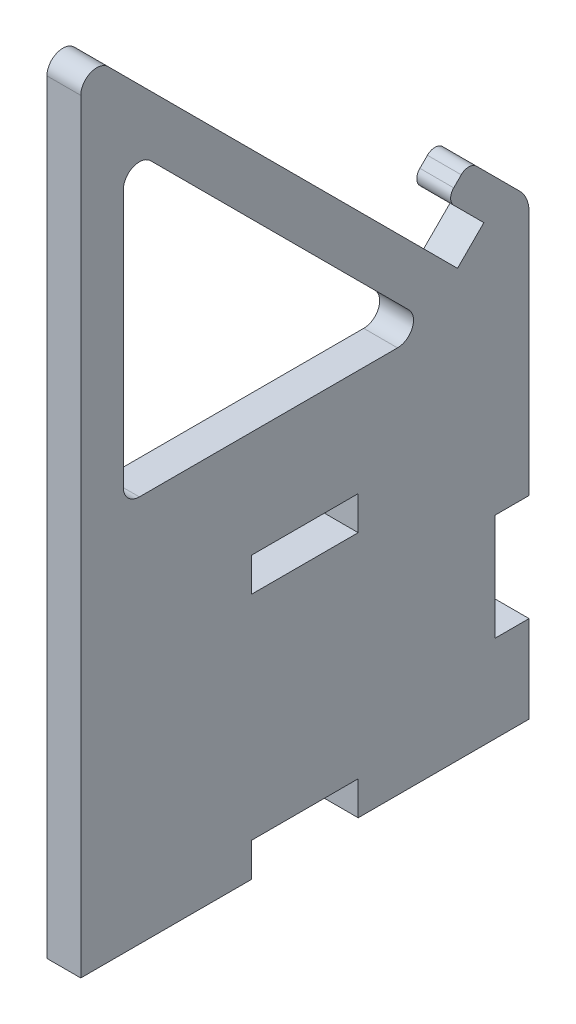
ISO-10303-21;
HEADER;
FILE_DESCRIPTION(('STEP AP214'),'2;1');
FILE_NAME('part.step','',(''),(''),'','','');
FILE_SCHEMA(('AUTOMOTIVE_DESIGN { 1 0 10303 214 1 1 1 1 }'));
ENDSEC;
DATA;
#1=APPLICATION_CONTEXT('core data for automotive mechanical design processes');
#2=APPLICATION_PROTOCOL_DEFINITION('international standard','automotive_design',2000,#1);
#3=PRODUCT_CONTEXT('',#1,'mechanical');
#4=PRODUCT('Part','Part','',(#3));
#5=PRODUCT_RELATED_PRODUCT_CATEGORY('part','',(#4));
#6=PRODUCT_DEFINITION_FORMATION('','',#4);
#7=PRODUCT_DEFINITION_CONTEXT('part definition',#1,'design');
#8=PRODUCT_DEFINITION('design','',#6,#7);
#9=PRODUCT_DEFINITION_SHAPE('','',#8);
#10=(LENGTH_UNIT() NAMED_UNIT(*) SI_UNIT(.MILLI.,.METRE.));
#11=(NAMED_UNIT(*) PLANE_ANGLE_UNIT() SI_UNIT($,.RADIAN.));
#12=(NAMED_UNIT(*) SI_UNIT($,.STERADIAN.) SOLID_ANGLE_UNIT());
#13=UNCERTAINTY_MEASURE_WITH_UNIT(LENGTH_MEASURE(1.E-05),#10,'distance_accuracy_value','');
#14=(GEOMETRIC_REPRESENTATION_CONTEXT(3) GLOBAL_UNCERTAINTY_ASSIGNED_CONTEXT((#13)) GLOBAL_UNIT_ASSIGNED_CONTEXT((#10,
#11,#12)) REPRESENTATION_CONTEXT('',''));
#15=CARTESIAN_POINT('',(0.,0.,0.));
#16=DIRECTION('',(0.,0.,1.));
#17=DIRECTION('',(1.,0.,0.));
#18=AXIS2_PLACEMENT_3D('',#15,#16,#17);
#19=CARTESIAN_POINT('',(6.35,0.,42.0728534805994));
#20=DIRECTION('',(0.,1.,0.));
#21=DIRECTION('',(0.,0.,1.));
#22=AXIS2_PLACEMENT_3D('',#19,#20,#21);
#23=PLANE('',#22);
#24=DIRECTION('',(0.,0.,-1.));
#25=VECTOR('',#24,1.);
#26=CARTESIAN_POINT('',(0.,0.,42.0728534805994));
#27=LINE('',#26,#25);
#28=CARTESIAN_POINT('',(0.,0.,42.0728534805994));
#29=VERTEX_POINT('',#28);
#30=CARTESIAN_POINT('',(0.,0.,10.));
#31=VERTEX_POINT('',#30);
#32=EDGE_CURVE('E255',#29,#31,#27,.T.);
#33=ORIENTED_EDGE('',*,*,#32,.T.);
#34=DIRECTION('',(1.,0.,0.));
#35=VECTOR('',#34,1.);
#36=CARTESIAN_POINT('',(0.,0.,10.));
#37=LINE('',#36,#35);
#38=CARTESIAN_POINT('',(6.35,0.,10.));
#39=VERTEX_POINT('',#38);
#40=EDGE_CURVE('E238',#31,#39,#37,.T.);
#41=ORIENTED_EDGE('',*,*,#40,.T.);
#42=DIRECTION('',(0.,0.,-1.));
#43=VECTOR('',#42,1.);
#44=CARTESIAN_POINT('',(6.35,0.,42.0728534805994));
#45=LINE('',#44,#43);
#46=CARTESIAN_POINT('',(6.35,0.,42.0728534805994));
#47=VERTEX_POINT('',#46);
#48=EDGE_CURVE('E545',#47,#39,#45,.T.);
#49=ORIENTED_EDGE('',*,*,#48,.F.);
#50=DIRECTION('',(-1.,0.,0.));
#51=VECTOR('',#50,1.);
#52=CARTESIAN_POINT('',(6.35,0.,42.0728534805994));
#53=LINE('',#52,#51);
#54=EDGE_CURVE('E263',#47,#29,#53,.T.);
#55=ORIENTED_EDGE('',*,*,#54,.T.);
#56=EDGE_LOOP('',(#33,#41,#49,#55));
#57=FACE_BOUND('',#56,.T.);
#58=ADVANCED_FACE('F39',(#57),#23,.F.);
#59=CARTESIAN_POINT('',(6.35,0.,-42.0728534805994));
#60=DIRECTION('',(0.,0.,1.));
#61=DIRECTION('',(0.,-1.,0.));
#62=AXIS2_PLACEMENT_3D('',#59,#60,#61);
#63=PLANE('',#62);
#64=DIRECTION('',(0.,1.,0.));
#65=VECTOR('',#64,1.);
#66=CARTESIAN_POINT('',(0.,0.,-42.0728534805994));
#67=LINE('',#66,#65);
#68=CARTESIAN_POINT('',(0.,0.,-42.0728534805994));
#69=VERTEX_POINT('',#68);
#70=CARTESIAN_POINT('',(0.,16.35,-42.0728534805994));
#71=VERTEX_POINT('',#70);
#72=EDGE_CURVE('E271',#69,#71,#67,.T.);
#73=ORIENTED_EDGE('',*,*,#72,.T.);
#74=DIRECTION('',(1.,0.,0.));
#75=VECTOR('',#74,1.);
#76=CARTESIAN_POINT('',(0.,16.35,-42.0728534805994));
#77=LINE('',#76,#75);
#78=CARTESIAN_POINT('',(6.35,16.35,-42.0728534805994));
#79=VERTEX_POINT('',#78);
#80=EDGE_CURVE('E486',#71,#79,#77,.T.);
#81=ORIENTED_EDGE('',*,*,#80,.T.);
#82=DIRECTION('',(0.,1.,0.));
#83=VECTOR('',#82,1.);
#84=CARTESIAN_POINT('',(6.35,0.,-42.0728534805994));
#85=LINE('',#84,#83);
#86=CARTESIAN_POINT('',(6.35,0.,-42.0728534805994));
#87=VERTEX_POINT('',#86);
#88=EDGE_CURVE('E549',#87,#79,#85,.T.);
#89=ORIENTED_EDGE('',*,*,#88,.F.);
#90=DIRECTION('',(-1.,0.,0.));
#91=VECTOR('',#90,1.);
#92=CARTESIAN_POINT('',(6.35,0.,-42.0728534805994));
#93=LINE('',#92,#91);
#94=EDGE_CURVE('E306',#87,#69,#93,.T.);
#95=ORIENTED_EDGE('',*,*,#94,.T.);
#96=EDGE_LOOP('',(#73,#81,#89,#95));
#97=FACE_BOUND('',#96,.T.);
#98=ADVANCED_FACE('F593',(#97),#63,.F.);
#99=CARTESIAN_POINT('',(6.35,150.710678118654,42.0728534805994));
#100=DIRECTION('',(0.,0.,-1.));
#101=DIRECTION('',(0.,1.,0.));
#102=AXIS2_PLACEMENT_3D('',#99,#100,#101);
#103=PLANE('',#102);
#104=DIRECTION('',(0.,-1.,0.));
#105=VECTOR('',#104,1.);
#106=CARTESIAN_POINT('',(6.35,150.710678118654,42.0728534805994));
#107=LINE('',#106,#105);
#108=CARTESIAN_POINT('',(6.35,143.468037431535,42.0728534805994));
#109=VERTEX_POINT('',#108);
#110=EDGE_CURVE('E296',#109,#47,#107,.T.);
#111=ORIENTED_EDGE('',*,*,#110,.F.);
#112=DIRECTION('',(-1.,0.,0.));
#113=VECTOR('',#112,1.);
#114=CARTESIAN_POINT('',(6.35,143.468037431535,42.0728534805994));
#115=LINE('',#114,#113);
#116=CARTESIAN_POINT('',(0.,143.468037431535,42.0728534805994));
#117=VERTEX_POINT('',#116);
#118=EDGE_CURVE('E372',#109,#117,#115,.T.);
#119=ORIENTED_EDGE('',*,*,#118,.T.);
#120=DIRECTION('',(0.,-1.,0.));
#121=VECTOR('',#120,1.);
#122=CARTESIAN_POINT('',(0.,150.710678118654,42.0728534805994));
#123=LINE('',#122,#121);
#124=EDGE_CURVE('E273',#117,#29,#123,.T.);
#125=ORIENTED_EDGE('',*,*,#124,.T.);
#126=ORIENTED_EDGE('',*,*,#54,.F.);
#127=EDGE_LOOP('',(#111,#119,#125,#126));
#128=FACE_BOUND('',#127,.T.);
#129=ADVANCED_FACE('F575',(#128),#103,.F.);
#130=CARTESIAN_POINT('',(6.35,0.,-10.));
#131=VERTEX_POINT('',#130);
#132=EDGE_CURVE('E544',#131,#87,#45,.T.);
#133=ORIENTED_EDGE('',*,*,#132,.F.);
#134=DIRECTION('',(1.,0.,0.));
#135=VECTOR('',#134,1.);
#136=CARTESIAN_POINT('',(0.,0.,-10.));
#137=LINE('',#136,#135);
#138=CARTESIAN_POINT('',(0.,0.,-10.));
#139=VERTEX_POINT('',#138);
#140=EDGE_CURVE('E250',#139,#131,#137,.T.);
#141=ORIENTED_EDGE('',*,*,#140,.F.);
#142=EDGE_CURVE('E266',#139,#69,#27,.T.);
#143=ORIENTED_EDGE('',*,*,#142,.T.);
#144=ORIENTED_EDGE('',*,*,#94,.F.);
#145=EDGE_LOOP('',(#133,#141,#143,#144));
#146=FACE_BOUND('',#145,.T.);
#147=ADVANCED_FACE('F588',(#146),#23,.F.);
#148=CARTESIAN_POINT('',(0.,36.35,-42.0728534805994));
#149=VERTEX_POINT('',#148);
#150=CARTESIAN_POINT('',(0.,82.4644660940667,-42.0728534805994));
#151=VERTEX_POINT('',#150);
#152=EDGE_CURVE('E265',#149,#151,#67,.T.);
#153=ORIENTED_EDGE('',*,*,#152,.T.);
#154=DIRECTION('',(-1.,0.,0.));
#155=VECTOR('',#154,1.);
#156=CARTESIAN_POINT('',(6.35,82.4644660940667,-42.0728534805994));
#157=LINE('',#156,#155);
#158=CARTESIAN_POINT('',(6.35,82.4644660940667,-42.0728534805994));
#159=VERTEX_POINT('',#158);
#160=EDGE_CURVE('E319',#151,#159,#157,.F.);
#161=ORIENTED_EDGE('',*,*,#160,.T.);
#162=CARTESIAN_POINT('',(6.35,36.35,-42.0728534805994));
#163=VERTEX_POINT('',#162);
#164=EDGE_CURVE('E548',#163,#159,#85,.T.);
#165=ORIENTED_EDGE('',*,*,#164,.F.);
#166=DIRECTION('',(1.,0.,0.));
#167=VECTOR('',#166,1.);
#168=CARTESIAN_POINT('',(0.,36.35,-42.0728534805994));
#169=LINE('',#168,#167);
#170=EDGE_CURVE('E521',#149,#163,#169,.T.);
#171=ORIENTED_EDGE('',*,*,#170,.F.);
#172=EDGE_LOOP('',(#153,#161,#165,#171));
#173=FACE_BOUND('',#172,.T.);
#174=ADVANCED_FACE('F652',(#173),#63,.F.);
#175=CARTESIAN_POINT('',(6.35,84.9497474683053,-42.0728534805994));
#176=DIRECTION('',(0.,-0.707106781186558,0.707106781186537));
#177=DIRECTION('',(0.,-0.707106781186537,-0.707106781186558));
#178=AXIS2_PLACEMENT_3D('',#175,#176,#177);
#179=PLANE('',#178);
#180=DIRECTION('',(0.,0.707106781186537,0.707106781186558));
#181=VECTOR('',#180,1.);
#182=CARTESIAN_POINT('',(0.,84.9497474683053,-42.0728534805994));
#183=LINE('',#182,#181);
#184=CARTESIAN_POINT('',(0.,86.707106781186,-40.3154941677186));
#185=VERTEX_POINT('',#184);
#186=CARTESIAN_POINT('',(0.,94.8492424049166,-32.1733585439878));
#187=VERTEX_POINT('',#186);
#188=EDGE_CURVE('E279',#185,#187,#183,.T.);
#189=ORIENTED_EDGE('',*,*,#188,.T.);
#190=DIRECTION('',(-1.,0.,0.));
#191=VECTOR('',#190,1.);
#192=CARTESIAN_POINT('',(6.35,94.8492424049166,-32.1733585439878));
#193=LINE('',#192,#191);
#194=CARTESIAN_POINT('',(6.35,94.8492424049166,-32.1733585439878));
#195=VERTEX_POINT('',#194);
#196=EDGE_CURVE('E348',#187,#195,#193,.F.);
#197=ORIENTED_EDGE('',*,*,#196,.T.);
#198=DIRECTION('',(0.,0.707106781186537,0.707106781186558));
#199=VECTOR('',#198,1.);
#200=CARTESIAN_POINT('',(6.35,84.9497474683053,-42.0728534805994));
#201=LINE('',#200,#199);
#202=CARTESIAN_POINT('',(6.35,86.707106781186,-40.3154941677186));
#203=VERTEX_POINT('',#202);
#204=EDGE_CURVE('E553',#203,#195,#201,.T.);
#205=ORIENTED_EDGE('',*,*,#204,.F.);
#206=DIRECTION('',(-1.,0.,0.));
#207=VECTOR('',#206,1.);
#208=CARTESIAN_POINT('',(6.35,86.707106781186,-40.3154941677186));
#209=LINE('',#208,#207);
#210=EDGE_CURVE('E312',#203,#185,#209,.T.);
#211=ORIENTED_EDGE('',*,*,#210,.T.);
#212=EDGE_LOOP('',(#189,#197,#205,#211));
#213=FACE_BOUND('',#212,.T.);
#214=ADVANCED_FACE('F612',(#213),#179,.F.);
#215=CARTESIAN_POINT('',(6.35,96.2634559672896,-30.7591449816147));
#216=DIRECTION('',(0.,-0.70710678118655,-0.707106781186545));
#217=DIRECTION('',(0.,0.707106781186545,-0.70710678118655));
#218=AXIS2_PLACEMENT_3D('',#215,#216,#217);
#219=PLANE('',#218);
#220=DIRECTION('',(0.,-0.707106781186545,0.70710678118655));
#221=VECTOR('',#220,1.);
#222=CARTESIAN_POINT('',(0.,96.2634559672896,-30.7591449816147));
#223=LINE('',#222,#221);
#224=CARTESIAN_POINT('',(0.,94.8492424049166,-29.3449314192416));
#225=VERTEX_POINT('',#224);
#226=CARTESIAN_POINT('',(0.,93.4350288425435,-27.9307178568685));
#227=VERTEX_POINT('',#226);
#228=EDGE_CURVE('E283',#225,#227,#223,.T.);
#229=ORIENTED_EDGE('',*,*,#228,.T.);
#230=DIRECTION('',(-1.,0.,0.));
#231=VECTOR('',#230,1.);
#232=CARTESIAN_POINT('',(6.35,93.4350288425435,-27.9307178568685));
#233=LINE('',#232,#231);
#234=CARTESIAN_POINT('',(6.35,93.4350288425435,-27.9307178568685));
#235=VERTEX_POINT('',#234);
#236=EDGE_CURVE('E339',#227,#235,#233,.F.);
#237=ORIENTED_EDGE('',*,*,#236,.T.);
#238=DIRECTION('',(0.,-0.707106781186545,0.70710678118655));
#239=VECTOR('',#238,1.);
#240=CARTESIAN_POINT('',(6.35,96.2634559672896,-30.7591449816147));
#241=LINE('',#240,#239);
#242=CARTESIAN_POINT('',(6.35,94.8492424049166,-29.3449314192416));
#243=VERTEX_POINT('',#242);
#244=EDGE_CURVE('E557',#243,#235,#241,.T.);
#245=ORIENTED_EDGE('',*,*,#244,.F.);
#246=DIRECTION('',(-1.,0.,0.));
#247=VECTOR('',#246,1.);
#248=CARTESIAN_POINT('',(6.35,94.8492424049166,-29.3449314192416));
#249=LINE('',#248,#247);
#250=EDGE_CURVE('E335',#243,#225,#249,.T.);
#251=ORIENTED_EDGE('',*,*,#250,.T.);
#252=EDGE_LOOP('',(#229,#237,#245,#251));
#253=FACE_BOUND('',#252,.T.);
#254=ADVANCED_FACE('F622',(#253),#219,.F.);
#255=CARTESIAN_POINT('',(6.35,92.0208152801704,-26.5165042944954));
#256=DIRECTION('',(0.,0.707106781186544,-0.707106781186551));
#257=DIRECTION('',(0.,0.707106781186551,0.707106781186544));
#258=AXIS2_PLACEMENT_3D('',#255,#256,#257);
#259=PLANE('',#258);
#260=DIRECTION('',(0.,-0.707106781186551,-0.707106781186544));
#261=VECTOR('',#260,1.);
#262=CARTESIAN_POINT('',(6.35,92.0208152801704,-26.5165042944954));
#263=LINE('',#262,#261);
#264=CARTESIAN_POINT('',(6.35,90.6066017177973,-27.9307178568685));
#265=VERTEX_POINT('',#264);
#266=CARTESIAN_POINT('',(6.35,84.9497474683049,-33.5875721063609));
#267=VERTEX_POINT('',#266);
#268=EDGE_CURVE('E561',#265,#267,#263,.T.);
#269=ORIENTED_EDGE('',*,*,#268,.F.);
#270=DIRECTION('',(-1.,0.,0.));
#271=VECTOR('',#270,1.);
#272=CARTESIAN_POINT('',(6.35,90.6066017177973,-27.9307178568685));
#273=LINE('',#272,#271);
#274=CARTESIAN_POINT('',(0.,90.6066017177973,-27.9307178568685));
#275=VERTEX_POINT('',#274);
#276=EDGE_CURVE('E325',#265,#275,#273,.T.);
#277=ORIENTED_EDGE('',*,*,#276,.T.);
#278=DIRECTION('',(0.,-0.707106781186551,-0.707106781186544));
#279=VECTOR('',#278,1.);
#280=CARTESIAN_POINT('',(0.,92.0208152801704,-26.5165042944954));
#281=LINE('',#280,#279);
#282=CARTESIAN_POINT('',(0.,84.9497474683049,-33.5875721063609));
#283=VERTEX_POINT('',#282);
#284=EDGE_CURVE('E287',#275,#283,#281,.T.);
#285=ORIENTED_EDGE('',*,*,#284,.T.);
#286=DIRECTION('',(-1.,0.,0.));
#287=VECTOR('',#286,1.);
#288=CARTESIAN_POINT('',(6.35,84.9497474683049,-33.5875721063609));
#289=LINE('',#288,#287);
#290=EDGE_CURVE('E301',#267,#283,#289,.T.);
#291=ORIENTED_EDGE('',*,*,#290,.F.);
#292=EDGE_LOOP('',(#269,#277,#285,#291));
#293=FACE_BOUND('',#292,.T.);
#294=ADVANCED_FACE('F631',(#293),#259,.F.);
#295=CARTESIAN_POINT('',(6.35,84.9497474683049,-33.5875721063609));
#296=DIRECTION('',(0.,-0.707106781186552,-0.707106781186543));
#297=DIRECTION('',(0.,0.707106781186543,-0.707106781186552));
#298=AXIS2_PLACEMENT_3D('',#295,#296,#297);
#299=PLANE('',#298);
#300=DIRECTION('',(0.,-0.707106781186543,0.707106781186552));
#301=VECTOR('',#300,1.);
#302=CARTESIAN_POINT('',(0.,84.9497474683049,-33.5875721063609));
#303=LINE('',#302,#301);
#304=CARTESIAN_POINT('',(0.,79.9999999999991,-28.637824638055));
#305=VERTEX_POINT('',#304);
#306=EDGE_CURVE('E290',#283,#305,#303,.T.);
#307=ORIENTED_EDGE('',*,*,#306,.T.);
#308=DIRECTION('',(-1.,0.,0.));
#309=VECTOR('',#308,1.);
#310=CARTESIAN_POINT('',(6.35,79.9999999999991,-28.637824638055));
#311=LINE('',#310,#309);
#312=CARTESIAN_POINT('',(6.35,79.9999999999991,-28.637824638055));
#313=VERTEX_POINT('',#312);
#314=EDGE_CURVE('E297',#313,#305,#311,.T.);
#315=ORIENTED_EDGE('',*,*,#314,.F.);
#316=DIRECTION('',(0.,-0.707106781186543,0.707106781186552));
#317=VECTOR('',#316,1.);
#318=CARTESIAN_POINT('',(6.35,84.9497474683049,-33.5875721063609));
#319=LINE('',#318,#317);
#320=EDGE_CURVE('E564',#267,#313,#319,.T.);
#321=ORIENTED_EDGE('',*,*,#320,.F.);
#322=ORIENTED_EDGE('',*,*,#290,.T.);
#323=EDGE_LOOP('',(#307,#315,#321,#322));
#324=FACE_BOUND('',#323,.T.);
#325=ADVANCED_FACE('F635',(#324),#299,.F.);
#326=CARTESIAN_POINT('',(6.35,79.9999999999991,-28.637824638055));
#327=DIRECTION('',(0.,-0.707106781186544,0.707106781186551));
#328=DIRECTION('',(0.,-0.707106781186551,-0.707106781186544));
#329=AXIS2_PLACEMENT_3D('',#326,#327,#328);
#330=PLANE('',#329);
#331=DIRECTION('',(0.,0.707106781186551,0.707106781186544));
#332=VECTOR('',#331,1.);
#333=CARTESIAN_POINT('',(0.,79.9999999999991,-28.637824638055));
#334=LINE('',#333,#332);
#335=CARTESIAN_POINT('',(0.,145.589357775094,36.9515331370397));
#336=VERTEX_POINT('',#335);
#337=EDGE_CURVE('E293',#305,#336,#334,.T.);
#338=ORIENTED_EDGE('',*,*,#337,.T.);
#339=DIRECTION('',(-1.,0.,0.));
#340=VECTOR('',#339,1.);
#341=CARTESIAN_POINT('',(6.35,145.589357775094,36.9515331370397));
#342=LINE('',#341,#340);
#343=CARTESIAN_POINT('',(6.35,145.589357775094,36.9515331370397));
#344=VERTEX_POINT('',#343);
#345=EDGE_CURVE('E55',#336,#344,#342,.F.);
#346=ORIENTED_EDGE('',*,*,#345,.T.);
#347=DIRECTION('',(0.,0.707106781186551,0.707106781186544));
#348=VECTOR('',#347,1.);
#349=CARTESIAN_POINT('',(6.35,79.9999999999991,-28.637824638055));
#350=LINE('',#349,#348);
#351=EDGE_CURVE('E302',#313,#344,#350,.T.);
#352=ORIENTED_EDGE('',*,*,#351,.F.);
#353=ORIENTED_EDGE('',*,*,#314,.T.);
#354=EDGE_LOOP('',(#338,#346,#352,#353));
#355=FACE_BOUND('',#354,.T.);
#356=ADVANCED_FACE('F636',(#355),#330,.F.);
#357=CARTESIAN_POINT('',(6.35,0.,0.));
#358=DIRECTION('',(1.,0.,0.));
#359=DIRECTION('',(0.,0.,-1.));
#360=AXIS2_PLACEMENT_3D('',#357,#358,#359);
#361=PLANE('',#360);
#362=DIRECTION('',(0.,0.707106781186547,0.707106781186548));
#363=VECTOR('',#362,1.);
#364=CARTESIAN_POINT('',(6.35,131.396969619669,34.0728534805994));
#365=LINE('',#364,#363);
#366=CARTESIAN_POINT('',(6.35,77.8213203435596,-19.5027957955097));
#367=VERTEX_POINT('',#366);
#368=CARTESIAN_POINT('',(6.35,126.275649276109,28.9515331370397));
#369=VERTEX_POINT('',#368);
#370=EDGE_CURVE('E401',#367,#369,#365,.T.);
#371=ORIENTED_EDGE('',*,*,#370,.F.);
#372=CARTESIAN_POINT('',(6.35,75.7,-17.38147545195));
#373=DIRECTION('',(1.,0.,0.));
#374=DIRECTION('',(0.,0.,-1.));
#375=AXIS2_PLACEMENT_3D('',#372,#373,#374);
#376=CIRCLE('',#375,3.);
#377=CARTESIAN_POINT('',(6.35,72.7,-17.38147545195));
#378=VERTEX_POINT('',#377);
#379=EDGE_CURVE('E383',#367,#378,#376,.F.);
#380=ORIENTED_EDGE('',*,*,#379,.T.);
#381=DIRECTION('',(0.,0.,-1.));
#382=VECTOR('',#381,1.);
#383=CARTESIAN_POINT('',(6.35,72.7,-24.6241161390693));
#384=LINE('',#383,#382);
#385=CARTESIAN_POINT('',(6.35,72.7,31.0728534805994));
#386=VERTEX_POINT('',#385);
#387=EDGE_CURVE('E434',#386,#378,#384,.T.);
#388=ORIENTED_EDGE('',*,*,#387,.F.);
#389=CARTESIAN_POINT('',(6.35,75.7,31.0728534805994));
#390=DIRECTION('',(1.,0.,0.));
#391=DIRECTION('',(0.,0.,-1.));
#392=AXIS2_PLACEMENT_3D('',#389,#390,#391);
#393=CIRCLE('',#392,3.);
#394=CARTESIAN_POINT('',(6.35,75.7,34.0728534805994));
#395=VERTEX_POINT('',#394);
#396=EDGE_CURVE('E389',#386,#395,#393,.F.);
#397=ORIENTED_EDGE('',*,*,#396,.T.);
#398=DIRECTION('',(0.,-1.,0.));
#399=VECTOR('',#398,1.);
#400=CARTESIAN_POINT('',(6.35,72.7,34.0728534805994));
#401=LINE('',#400,#399);
#402=CARTESIAN_POINT('',(6.35,124.154328932549,34.0728534805994));
#403=VERTEX_POINT('',#402);
#404=EDGE_CURVE('E403',#403,#395,#401,.T.);
#405=ORIENTED_EDGE('',*,*,#404,.F.);
#406=CARTESIAN_POINT('',(6.35,124.154328932549,31.0728534805994));
#407=DIRECTION('',(1.,0.,0.));
#408=DIRECTION('',(0.,0.,-1.));
#409=AXIS2_PLACEMENT_3D('',#406,#407,#408);
#410=CIRCLE('',#409,3.);
#411=EDGE_CURVE('E48',#403,#369,#410,.F.);
#412=ORIENTED_EDGE('',*,*,#411,.T.);
#413=EDGE_LOOP('',(#371,#380,#388,#397,#405,#412));
#414=FACE_BOUND('',#413,.T.);
#415=ORIENTED_EDGE('',*,*,#351,.T.);
#416=CARTESIAN_POINT('',(6.35,143.468037431535,39.0728534805994));
#417=DIRECTION('',(1.,0.,0.));
#418=DIRECTION('',(0.,0.,-1.));
#419=AXIS2_PLACEMENT_3D('',#416,#417,#418);
#420=CIRCLE('',#419,3.);
#421=EDGE_CURVE('E380',#344,#109,#420,.T.);
#422=ORIENTED_EDGE('',*,*,#421,.T.);
#423=ORIENTED_EDGE('',*,*,#110,.T.);
#424=ORIENTED_EDGE('',*,*,#48,.T.);
#425=DIRECTION('',(0.,-1.,0.));
#426=VECTOR('',#425,1.);
#427=CARTESIAN_POINT('',(6.35,0.,10.));
#428=LINE('',#427,#426);
#429=CARTESIAN_POINT('',(6.35,6.35,10.));
#430=VERTEX_POINT('',#429);
#431=EDGE_CURVE('E244',#430,#39,#428,.T.);
#432=ORIENTED_EDGE('',*,*,#431,.F.);
#433=DIRECTION('',(0.,0.,1.));
#434=VECTOR('',#433,1.);
#435=CARTESIAN_POINT('',(6.35,6.35,10.));
#436=LINE('',#435,#434);
#437=CARTESIAN_POINT('',(6.35,6.35,-10.));
#438=VERTEX_POINT('',#437);
#439=EDGE_CURVE('E260',#438,#430,#436,.T.);
#440=ORIENTED_EDGE('',*,*,#439,.F.);
#441=DIRECTION('',(0.,1.,0.));
#442=VECTOR('',#441,1.);
#443=CARTESIAN_POINT('',(6.35,0.,-10.));
#444=LINE('',#443,#442);
#445=EDGE_CURVE('E448',#131,#438,#444,.T.);
#446=ORIENTED_EDGE('',*,*,#445,.F.);
#447=ORIENTED_EDGE('',*,*,#132,.T.);
#448=ORIENTED_EDGE('',*,*,#88,.T.);
#449=DIRECTION('',(0.,0.,-1.));
#450=VECTOR('',#449,1.);
#451=CARTESIAN_POINT('',(6.35,16.35,-42.0728534805994));
#452=LINE('',#451,#450);
#453=CARTESIAN_POINT('',(6.35,16.35,-35.7228534805994));
#454=VERTEX_POINT('',#453);
#455=EDGE_CURVE('E513',#454,#79,#452,.T.);
#456=ORIENTED_EDGE('',*,*,#455,.F.);
#457=DIRECTION('',(0.,-1.,0.));
#458=VECTOR('',#457,1.);
#459=CARTESIAN_POINT('',(6.35,36.35,-35.7228534805994));
#460=LINE('',#459,#458);
#461=CARTESIAN_POINT('',(6.35,36.35,-35.7228534805994));
#462=VERTEX_POINT('',#461);
#463=EDGE_CURVE('E525',#462,#454,#460,.T.);
#464=ORIENTED_EDGE('',*,*,#463,.F.);
#465=DIRECTION('',(0.,0.,1.));
#466=VECTOR('',#465,1.);
#467=CARTESIAN_POINT('',(6.35,36.35,-42.0728534805994));
#468=LINE('',#467,#466);
#469=EDGE_CURVE('E432',#163,#462,#468,.T.);
#470=ORIENTED_EDGE('',*,*,#469,.F.);
#471=ORIENTED_EDGE('',*,*,#164,.T.);
#472=CARTESIAN_POINT('',(6.35,82.4644660940667,-36.0728534805994));
#473=DIRECTION('',(1.,0.,0.));
#474=DIRECTION('',(0.,0.,-1.));
#475=AXIS2_PLACEMENT_3D('',#472,#473,#474);
#476=CIRCLE('',#475,6.);
#477=EDGE_CURVE('E322',#159,#203,#476,.T.);
#478=ORIENTED_EDGE('',*,*,#477,.T.);
#479=ORIENTED_EDGE('',*,*,#204,.T.);
#480=CARTESIAN_POINT('',(6.35,93.4350288425435,-30.7591449816147));
#481=DIRECTION('',(1.,0.,0.));
#482=DIRECTION('',(0.,0.,-1.));
#483=AXIS2_PLACEMENT_3D('',#480,#481,#482);
#484=CIRCLE('',#483,2.);
#485=EDGE_CURVE('E342',#195,#243,#484,.T.);
#486=ORIENTED_EDGE('',*,*,#485,.T.);
#487=ORIENTED_EDGE('',*,*,#244,.T.);
#488=CARTESIAN_POINT('',(6.35,92.0208152801704,-29.3449314192416));
#489=DIRECTION('',(1.,0.,0.));
#490=DIRECTION('',(0.,0.,-1.));
#491=AXIS2_PLACEMENT_3D('',#488,#489,#490);
#492=CIRCLE('',#491,2.);
#493=EDGE_CURVE('E345',#235,#265,#492,.T.);
#494=ORIENTED_EDGE('',*,*,#493,.T.);
#495=ORIENTED_EDGE('',*,*,#268,.T.);
#496=ORIENTED_EDGE('',*,*,#320,.T.);
#497=EDGE_LOOP('',(#415,#422,#423,#424,#432,#440,#446,#447,#448,#456,#464,#470,#471,#478,#479,
#486,#487,#494,#495,#496));
#498=FACE_BOUND('',#497,.T.);
#499=DIRECTION('',(0.,-1.,0.));
#500=VECTOR('',#499,1.);
#501=CARTESIAN_POINT('',(6.35,52.7,10.));
#502=LINE('',#501,#500);
#503=CARTESIAN_POINT('',(6.35,52.7,10.));
#504=VERTEX_POINT('',#503);
#505=CARTESIAN_POINT('',(6.35,46.35,10.));
#506=VERTEX_POINT('',#505);
#507=EDGE_CURVE('E482',#504,#506,#502,.T.);
#508=ORIENTED_EDGE('',*,*,#507,.F.);
#509=DIRECTION('',(0.,0.,1.));
#510=VECTOR('',#509,1.);
#511=CARTESIAN_POINT('',(6.35,52.7,10.));
#512=LINE('',#511,#510);
#513=CARTESIAN_POINT('',(6.35,52.7,-10.));
#514=VERTEX_POINT('',#513);
#515=EDGE_CURVE('E469',#514,#504,#512,.T.);
#516=ORIENTED_EDGE('',*,*,#515,.F.);
#517=DIRECTION('',(0.,1.,0.));
#518=VECTOR('',#517,1.);
#519=CARTESIAN_POINT('',(6.35,52.7,-10.));
#520=LINE('',#519,#518);
#521=CARTESIAN_POINT('',(6.35,46.35,-10.));
#522=VERTEX_POINT('',#521);
#523=EDGE_CURVE('E490',#522,#514,#520,.T.);
#524=ORIENTED_EDGE('',*,*,#523,.F.);
#525=DIRECTION('',(0.,0.,-1.));
#526=VECTOR('',#525,1.);
#527=CARTESIAN_POINT('',(6.35,46.35,10.));
#528=LINE('',#527,#526);
#529=EDGE_CURVE('E485',#506,#522,#528,.T.);
#530=ORIENTED_EDGE('',*,*,#529,.F.);
#531=EDGE_LOOP('',(#508,#516,#524,#530));
#532=FACE_BOUND('',#531,.T.);
#533=ADVANCED_FACE('F399',(#414,#498,#532),#361,.T.);
#534=CARTESIAN_POINT('',(0.,0.,0.));
#535=DIRECTION('',(1.,0.,0.));
#536=DIRECTION('',(0.,0.,-1.));
#537=AXIS2_PLACEMENT_3D('',#534,#535,#536);
#538=PLANE('',#537);
#539=DIRECTION('',(0.,-1.,0.));
#540=VECTOR('',#539,1.);
#541=CARTESIAN_POINT('',(0.,72.7,34.0728534805994));
#542=LINE('',#541,#540);
#543=CARTESIAN_POINT('',(0.,124.154328932549,34.0728534805994));
#544=VERTEX_POINT('',#543);
#545=CARTESIAN_POINT('',(0.,75.7,34.0728534805994));
#546=VERTEX_POINT('',#545);
#547=EDGE_CURVE('E420',#544,#546,#542,.T.);
#548=ORIENTED_EDGE('',*,*,#547,.T.);
#549=CARTESIAN_POINT('',(0.,75.7,31.0728534805994));
#550=DIRECTION('',(1.,0.,0.));
#551=DIRECTION('',(0.,0.,-1.));
#552=AXIS2_PLACEMENT_3D('',#549,#550,#551);
#553=CIRCLE('',#552,3.);
#554=CARTESIAN_POINT('',(0.,72.7,31.0728534805994));
#555=VERTEX_POINT('',#554);
#556=EDGE_CURVE('E392',#546,#555,#553,.T.);
#557=ORIENTED_EDGE('',*,*,#556,.T.);
#558=DIRECTION('',(0.,0.,-1.));
#559=VECTOR('',#558,1.);
#560=CARTESIAN_POINT('',(0.,72.7,-24.6241161390693));
#561=LINE('',#560,#559);
#562=CARTESIAN_POINT('',(0.,72.7,-17.38147545195));
#563=VERTEX_POINT('',#562);
#564=EDGE_CURVE('E427',#555,#563,#561,.T.);
#565=ORIENTED_EDGE('',*,*,#564,.T.);
#566=CARTESIAN_POINT('',(0.,75.7,-17.38147545195));
#567=DIRECTION('',(1.,0.,0.));
#568=DIRECTION('',(0.,0.,-1.));
#569=AXIS2_PLACEMENT_3D('',#566,#567,#568);
#570=CIRCLE('',#569,3.);
#571=CARTESIAN_POINT('',(0.,77.8213203435596,-19.5027957955097));
#572=VERTEX_POINT('',#571);
#573=EDGE_CURVE('E386',#563,#572,#570,.T.);
#574=ORIENTED_EDGE('',*,*,#573,.T.);
#575=DIRECTION('',(0.,0.707106781186547,0.707106781186548));
#576=VECTOR('',#575,1.);
#577=CARTESIAN_POINT('',(0.,131.396969619669,34.0728534805994));
#578=LINE('',#577,#576);
#579=CARTESIAN_POINT('',(0.,126.275649276109,28.9515331370397));
#580=VERTEX_POINT('',#579);
#581=EDGE_CURVE('E422',#572,#580,#578,.T.);
#582=ORIENTED_EDGE('',*,*,#581,.T.);
#583=CARTESIAN_POINT('',(0.,124.154328932549,31.0728534805994));
#584=DIRECTION('',(1.,0.,0.));
#585=DIRECTION('',(0.,0.,-1.));
#586=AXIS2_PLACEMENT_3D('',#583,#584,#585);
#587=CIRCLE('',#586,3.);
#588=EDGE_CURVE('E11',#580,#544,#587,.T.);
#589=ORIENTED_EDGE('',*,*,#588,.T.);
#590=EDGE_LOOP('',(#548,#557,#565,#574,#582,#589));
#591=FACE_BOUND('',#590,.T.);
#592=DIRECTION('',(0.,0.,1.));
#593=VECTOR('',#592,1.);
#594=CARTESIAN_POINT('',(0.,52.7,10.));
#595=LINE('',#594,#593);
#596=CARTESIAN_POINT('',(0.,52.7,-10.));
#597=VERTEX_POINT('',#596);
#598=CARTESIAN_POINT('',(0.,52.7,10.));
#599=VERTEX_POINT('',#598);
#600=EDGE_CURVE('E477',#597,#599,#595,.T.);
#601=ORIENTED_EDGE('',*,*,#600,.T.);
#602=DIRECTION('',(0.,-1.,0.));
#603=VECTOR('',#602,1.);
#604=CARTESIAN_POINT('',(0.,52.7,10.));
#605=LINE('',#604,#603);
#606=CARTESIAN_POINT('',(0.,46.35,10.));
#607=VERTEX_POINT('',#606);
#608=EDGE_CURVE('E464',#599,#607,#605,.T.);
#609=ORIENTED_EDGE('',*,*,#608,.T.);
#610=DIRECTION('',(0.,0.,-1.));
#611=VECTOR('',#610,1.);
#612=CARTESIAN_POINT('',(0.,46.35,10.));
#613=LINE('',#612,#611);
#614=CARTESIAN_POINT('',(0.,46.35,-10.));
#615=VERTEX_POINT('',#614);
#616=EDGE_CURVE('E468',#607,#615,#613,.T.);
#617=ORIENTED_EDGE('',*,*,#616,.T.);
#618=DIRECTION('',(0.,1.,0.));
#619=VECTOR('',#618,1.);
#620=CARTESIAN_POINT('',(0.,52.7,-10.));
#621=LINE('',#620,#619);
#622=EDGE_CURVE('E473',#615,#597,#621,.T.);
#623=ORIENTED_EDGE('',*,*,#622,.T.);
#624=EDGE_LOOP('',(#601,#609,#617,#623));
#625=FACE_BOUND('',#624,.T.);
#626=ORIENTED_EDGE('',*,*,#124,.F.);
#627=CARTESIAN_POINT('',(0.,143.468037431535,39.0728534805994));
#628=DIRECTION('',(1.,0.,0.));
#629=DIRECTION('',(0.,0.,-1.));
#630=AXIS2_PLACEMENT_3D('',#627,#628,#629);
#631=CIRCLE('',#630,3.);
#632=EDGE_CURVE('E63',#117,#336,#631,.F.);
#633=ORIENTED_EDGE('',*,*,#632,.T.);
#634=ORIENTED_EDGE('',*,*,#337,.F.);
#635=ORIENTED_EDGE('',*,*,#306,.F.);
#636=ORIENTED_EDGE('',*,*,#284,.F.);
#637=CARTESIAN_POINT('',(0.,92.0208152801704,-29.3449314192416));
#638=DIRECTION('',(1.,0.,0.));
#639=DIRECTION('',(0.,0.,-1.));
#640=AXIS2_PLACEMENT_3D('',#637,#638,#639);
#641=CIRCLE('',#640,2.);
#642=EDGE_CURVE('E332',#275,#227,#641,.F.);
#643=ORIENTED_EDGE('',*,*,#642,.T.);
#644=ORIENTED_EDGE('',*,*,#228,.F.);
#645=CARTESIAN_POINT('',(0.,93.4350288425435,-30.7591449816147));
#646=DIRECTION('',(1.,0.,0.));
#647=DIRECTION('',(0.,0.,-1.));
#648=AXIS2_PLACEMENT_3D('',#645,#646,#647);
#649=CIRCLE('',#648,2.);
#650=EDGE_CURVE('E329',#225,#187,#649,.F.);
#651=ORIENTED_EDGE('',*,*,#650,.T.);
#652=ORIENTED_EDGE('',*,*,#188,.F.);
#653=CARTESIAN_POINT('',(0.,82.4644660940667,-36.0728534805994));
#654=DIRECTION('',(1.,0.,0.));
#655=DIRECTION('',(0.,0.,-1.));
#656=AXIS2_PLACEMENT_3D('',#653,#654,#655);
#657=CIRCLE('',#656,6.);
#658=EDGE_CURVE('E316',#185,#151,#657,.F.);
#659=ORIENTED_EDGE('',*,*,#658,.T.);
#660=ORIENTED_EDGE('',*,*,#152,.F.);
#661=DIRECTION('',(0.,0.,1.));
#662=VECTOR('',#661,1.);
#663=CARTESIAN_POINT('',(0.,36.35,-42.0728534805994));
#664=LINE('',#663,#662);
#665=CARTESIAN_POINT('',(0.,36.35,-35.7228534805994));
#666=VERTEX_POINT('',#665);
#667=EDGE_CURVE('E508',#149,#666,#664,.T.);
#668=ORIENTED_EDGE('',*,*,#667,.T.);
#669=DIRECTION('',(0.,-1.,0.));
#670=VECTOR('',#669,1.);
#671=CARTESIAN_POINT('',(0.,36.35,-35.7228534805994));
#672=LINE('',#671,#670);
#673=CARTESIAN_POINT('',(0.,16.35,-35.7228534805994));
#674=VERTEX_POINT('',#673);
#675=EDGE_CURVE('E512',#666,#674,#672,.T.);
#676=ORIENTED_EDGE('',*,*,#675,.T.);
#677=DIRECTION('',(0.,0.,-1.));
#678=VECTOR('',#677,1.);
#679=CARTESIAN_POINT('',(0.,16.35,-42.0728534805994));
#680=LINE('',#679,#678);
#681=EDGE_CURVE('E517',#674,#71,#680,.T.);
#682=ORIENTED_EDGE('',*,*,#681,.T.);
#683=ORIENTED_EDGE('',*,*,#72,.F.);
#684=ORIENTED_EDGE('',*,*,#142,.F.);
#685=DIRECTION('',(0.,1.,0.));
#686=VECTOR('',#685,1.);
#687=CARTESIAN_POINT('',(0.,0.,-10.));
#688=LINE('',#687,#686);
#689=CARTESIAN_POINT('',(0.,6.35,-10.));
#690=VERTEX_POINT('',#689);
#691=EDGE_CURVE('E259',#139,#690,#688,.T.);
#692=ORIENTED_EDGE('',*,*,#691,.T.);
#693=DIRECTION('',(0.,0.,1.));
#694=VECTOR('',#693,1.);
#695=CARTESIAN_POINT('',(0.,6.35,10.));
#696=LINE('',#695,#694);
#697=CARTESIAN_POINT('',(0.,6.35,10.));
#698=VERTEX_POINT('',#697);
#699=EDGE_CURVE('E251',#690,#698,#696,.T.);
#700=ORIENTED_EDGE('',*,*,#699,.T.);
#701=DIRECTION('',(0.,-1.,0.));
#702=VECTOR('',#701,1.);
#703=CARTESIAN_POINT('',(0.,0.,10.));
#704=LINE('',#703,#702);
#705=EDGE_CURVE('E241',#698,#31,#704,.T.);
#706=ORIENTED_EDGE('',*,*,#705,.T.);
#707=ORIENTED_EDGE('',*,*,#32,.F.);
#708=EDGE_LOOP('',(#626,#633,#634,#635,#636,#643,#644,#651,#652,#659,#660,#668,#676,#682,#683,
#684,#692,#700,#706,#707));
#709=FACE_BOUND('',#708,.T.);
#710=ADVANCED_FACE('F254',(#591,#625,#709),#538,.F.);
#711=CARTESIAN_POINT('',(0.,16.35,-42.0728534805994));
#712=DIRECTION('',(0.,-1.,0.));
#713=DIRECTION('',(0.,0.,-1.));
#714=AXIS2_PLACEMENT_3D('',#711,#712,#713);
#715=PLANE('',#714);
#716=ORIENTED_EDGE('',*,*,#455,.T.);
#717=ORIENTED_EDGE('',*,*,#80,.F.);
#718=ORIENTED_EDGE('',*,*,#681,.F.);
#719=DIRECTION('',(1.,0.,0.));
#720=VECTOR('',#719,1.);
#721=CARTESIAN_POINT('',(0.,16.35,-35.7228534805994));
#722=LINE('',#721,#720);
#723=EDGE_CURVE('E534',#674,#454,#722,.T.);
#724=ORIENTED_EDGE('',*,*,#723,.T.);
#725=EDGE_LOOP('',(#716,#717,#718,#724));
#726=FACE_BOUND('',#725,.T.);
#727=ADVANCED_FACE('F733',(#726),#715,.F.);
#728=CARTESIAN_POINT('',(0.,36.35,-35.7228534805994));
#729=DIRECTION('',(0.,0.,1.));
#730=DIRECTION('',(0.,-1.,0.));
#731=AXIS2_PLACEMENT_3D('',#728,#729,#730);
#732=PLANE('',#731);
#733=ORIENTED_EDGE('',*,*,#463,.T.);
#734=ORIENTED_EDGE('',*,*,#723,.F.);
#735=ORIENTED_EDGE('',*,*,#675,.F.);
#736=DIRECTION('',(1.,0.,0.));
#737=VECTOR('',#736,1.);
#738=CARTESIAN_POINT('',(0.,36.35,-35.7228534805994));
#739=LINE('',#738,#737);
#740=EDGE_CURVE('E537',#666,#462,#739,.T.);
#741=ORIENTED_EDGE('',*,*,#740,.T.);
#742=EDGE_LOOP('',(#733,#734,#735,#741));
#743=FACE_BOUND('',#742,.T.);
#744=ADVANCED_FACE('F871',(#743),#732,.F.);
#745=CARTESIAN_POINT('',(0.,36.35,-42.0728534805994));
#746=DIRECTION('',(0.,1.,0.));
#747=DIRECTION('',(0.,0.,1.));
#748=AXIS2_PLACEMENT_3D('',#745,#746,#747);
#749=PLANE('',#748);
#750=ORIENTED_EDGE('',*,*,#469,.T.);
#751=ORIENTED_EDGE('',*,*,#740,.F.);
#752=ORIENTED_EDGE('',*,*,#667,.F.);
#753=ORIENTED_EDGE('',*,*,#170,.T.);
#754=EDGE_LOOP('',(#750,#751,#752,#753));
#755=FACE_BOUND('',#754,.T.);
#756=ADVANCED_FACE('F861',(#755),#749,.F.);
#757=CARTESIAN_POINT('',(0.,52.7,10.));
#758=DIRECTION('',(0.,0.,1.));
#759=DIRECTION('',(1.,0.,0.));
#760=AXIS2_PLACEMENT_3D('',#757,#758,#759);
#761=PLANE('',#760);
#762=ORIENTED_EDGE('',*,*,#507,.T.);
#763=DIRECTION('',(1.,0.,0.));
#764=VECTOR('',#763,1.);
#765=CARTESIAN_POINT('',(0.,46.35,10.));
#766=LINE('',#765,#764);
#767=EDGE_CURVE('E481',#607,#506,#766,.T.);
#768=ORIENTED_EDGE('',*,*,#767,.F.);
#769=ORIENTED_EDGE('',*,*,#608,.F.);
#770=DIRECTION('',(1.,0.,0.));
#771=VECTOR('',#770,1.);
#772=CARTESIAN_POINT('',(0.,52.7,10.));
#773=LINE('',#772,#771);
#774=EDGE_CURVE('E449',#599,#504,#773,.T.);
#775=ORIENTED_EDGE('',*,*,#774,.T.);
#776=EDGE_LOOP('',(#762,#768,#769,#775));
#777=FACE_BOUND('',#776,.T.);
#778=ADVANCED_FACE('F851',(#777),#761,.F.);
#779=CARTESIAN_POINT('',(0.,52.7,10.));
#780=DIRECTION('',(0.,1.,0.));
#781=DIRECTION('',(0.,0.,1.));
#782=AXIS2_PLACEMENT_3D('',#779,#780,#781);
#783=PLANE('',#782);
#784=ORIENTED_EDGE('',*,*,#515,.T.);
#785=ORIENTED_EDGE('',*,*,#774,.F.);
#786=ORIENTED_EDGE('',*,*,#600,.F.);
#787=DIRECTION('',(1.,0.,0.));
#788=VECTOR('',#787,1.);
#789=CARTESIAN_POINT('',(0.,52.7,-10.));
#790=LINE('',#789,#788);
#791=EDGE_CURVE('E499',#597,#514,#790,.T.);
#792=ORIENTED_EDGE('',*,*,#791,.T.);
#793=EDGE_LOOP('',(#784,#785,#786,#792));
#794=FACE_BOUND('',#793,.T.);
#795=ADVANCED_FACE('F841',(#794),#783,.F.);
#796=CARTESIAN_POINT('',(0.,52.7,-10.));
#797=DIRECTION('',(0.,0.,-1.));
#798=DIRECTION('',(0.,1.,0.));
#799=AXIS2_PLACEMENT_3D('',#796,#797,#798);
#800=PLANE('',#799);
#801=ORIENTED_EDGE('',*,*,#523,.T.);
#802=ORIENTED_EDGE('',*,*,#791,.F.);
#803=ORIENTED_EDGE('',*,*,#622,.F.);
#804=DIRECTION('',(1.,0.,0.));
#805=VECTOR('',#804,1.);
#806=CARTESIAN_POINT('',(0.,46.35,-10.));
#807=LINE('',#806,#805);
#808=EDGE_CURVE('E502',#615,#522,#807,.T.);
#809=ORIENTED_EDGE('',*,*,#808,.T.);
#810=EDGE_LOOP('',(#801,#802,#803,#809));
#811=FACE_BOUND('',#810,.T.);
#812=ADVANCED_FACE('F831',(#811),#800,.F.);
#813=CARTESIAN_POINT('',(0.,46.35,10.));
#814=DIRECTION('',(0.,-1.,0.));
#815=DIRECTION('',(0.,0.,-1.));
#816=AXIS2_PLACEMENT_3D('',#813,#814,#815);
#817=PLANE('',#816);
#818=ORIENTED_EDGE('',*,*,#529,.T.);
#819=ORIENTED_EDGE('',*,*,#808,.F.);
#820=ORIENTED_EDGE('',*,*,#616,.F.);
#821=ORIENTED_EDGE('',*,*,#767,.T.);
#822=EDGE_LOOP('',(#818,#819,#820,#821));
#823=FACE_BOUND('',#822,.T.);
#824=ADVANCED_FACE('F822',(#823),#817,.F.);
#825=CARTESIAN_POINT('',(0.,0.,10.));
#826=DIRECTION('',(0.,0.,1.));
#827=DIRECTION('',(1.,0.,0.));
#828=AXIS2_PLACEMENT_3D('',#825,#826,#827);
#829=PLANE('',#828);
#830=ORIENTED_EDGE('',*,*,#431,.T.);
#831=ORIENTED_EDGE('',*,*,#40,.F.);
#832=ORIENTED_EDGE('',*,*,#705,.F.);
#833=DIRECTION('',(1.,0.,0.));
#834=VECTOR('',#833,1.);
#835=CARTESIAN_POINT('',(0.,6.35,10.));
#836=LINE('',#835,#834);
#837=EDGE_CURVE('E456',#698,#430,#836,.T.);
#838=ORIENTED_EDGE('',*,*,#837,.T.);
#839=EDGE_LOOP('',(#830,#831,#832,#838));
#840=FACE_BOUND('',#839,.T.);
#841=ADVANCED_FACE('F240',(#840),#829,.F.);
#842=CARTESIAN_POINT('',(0.,6.35,10.));
#843=DIRECTION('',(0.,1.,0.));
#844=DIRECTION('',(0.,0.,1.));
#845=AXIS2_PLACEMENT_3D('',#842,#843,#844);
#846=PLANE('',#845);
#847=ORIENTED_EDGE('',*,*,#439,.T.);
#848=ORIENTED_EDGE('',*,*,#837,.F.);
#849=ORIENTED_EDGE('',*,*,#699,.F.);
#850=DIRECTION('',(1.,0.,0.));
#851=VECTOR('',#850,1.);
#852=CARTESIAN_POINT('',(0.,6.35,-10.));
#853=LINE('',#852,#851);
#854=EDGE_CURVE('E459',#690,#438,#853,.T.);
#855=ORIENTED_EDGE('',*,*,#854,.T.);
#856=EDGE_LOOP('',(#847,#848,#849,#855));
#857=FACE_BOUND('',#856,.T.);
#858=ADVANCED_FACE('F581',(#857),#846,.F.);
#859=CARTESIAN_POINT('',(0.,0.,-10.));
#860=DIRECTION('',(0.,0.,-1.));
#861=DIRECTION('',(0.,1.,0.));
#862=AXIS2_PLACEMENT_3D('',#859,#860,#861);
#863=PLANE('',#862);
#864=ORIENTED_EDGE('',*,*,#445,.T.);
#865=ORIENTED_EDGE('',*,*,#854,.F.);
#866=ORIENTED_EDGE('',*,*,#691,.F.);
#867=ORIENTED_EDGE('',*,*,#140,.T.);
#868=EDGE_LOOP('',(#864,#865,#866,#867));
#869=FACE_BOUND('',#868,.T.);
#870=ADVANCED_FACE('F584',(#869),#863,.F.);
#871=CARTESIAN_POINT('',(6.35,82.4644660940667,-36.0728534805994));
#872=DIRECTION('',(-1.,0.,0.));
#873=DIRECTION('',(0.,0.,1.));
#874=AXIS2_PLACEMENT_3D('',#871,#872,#873);
#875=CYLINDRICAL_SURFACE('',#874,6.);
#876=ORIENTED_EDGE('',*,*,#477,.F.);
#877=ORIENTED_EDGE('',*,*,#160,.F.);
#878=ORIENTED_EDGE('',*,*,#658,.F.);
#879=ORIENTED_EDGE('',*,*,#210,.F.);
#880=EDGE_LOOP('',(#876,#877,#878,#879));
#881=FACE_BOUND('',#880,.T.);
#882=ADVANCED_FACE('F609',(#881),#875,.T.);
#883=CARTESIAN_POINT('',(6.35,92.0208152801704,-29.3449314192416));
#884=DIRECTION('',(-1.,0.,0.));
#885=DIRECTION('',(0.,0.,1.));
#886=AXIS2_PLACEMENT_3D('',#883,#884,#885);
#887=CYLINDRICAL_SURFACE('',#886,2.);
#888=ORIENTED_EDGE('',*,*,#493,.F.);
#889=ORIENTED_EDGE('',*,*,#236,.F.);
#890=ORIENTED_EDGE('',*,*,#642,.F.);
#891=ORIENTED_EDGE('',*,*,#276,.F.);
#892=EDGE_LOOP('',(#888,#889,#890,#891));
#893=FACE_BOUND('',#892,.T.);
#894=ADVANCED_FACE('F628',(#893),#887,.T.);
#895=CARTESIAN_POINT('',(6.35,93.4350288425435,-30.7591449816147));
#896=DIRECTION('',(-1.,0.,0.));
#897=DIRECTION('',(0.,0.,1.));
#898=AXIS2_PLACEMENT_3D('',#895,#896,#897);
#899=CYLINDRICAL_SURFACE('',#898,2.);
#900=ORIENTED_EDGE('',*,*,#485,.F.);
#901=ORIENTED_EDGE('',*,*,#196,.F.);
#902=ORIENTED_EDGE('',*,*,#650,.F.);
#903=ORIENTED_EDGE('',*,*,#250,.F.);
#904=EDGE_LOOP('',(#900,#901,#902,#903));
#905=FACE_BOUND('',#904,.T.);
#906=ADVANCED_FACE('F619',(#905),#899,.T.);
#907=CARTESIAN_POINT('',(0.,131.396969619669,34.0728534805994));
#908=DIRECTION('',(0.,0.707106781186548,-0.707106781186547));
#909=DIRECTION('',(0.,0.707106781186547,0.707106781186548));
#910=AXIS2_PLACEMENT_3D('',#907,#908,#909);
#911=PLANE('',#910);
#912=ORIENTED_EDGE('',*,*,#581,.F.);
#913=DIRECTION('',(1.,0.,0.));
#914=VECTOR('',#913,1.);
#915=CARTESIAN_POINT('',(6.35,77.8213203435596,-19.5027957955097));
#916=LINE('',#915,#914);
#917=EDGE_CURVE('E354',#572,#367,#916,.T.);
#918=ORIENTED_EDGE('',*,*,#917,.T.);
#919=ORIENTED_EDGE('',*,*,#370,.T.);
#920=DIRECTION('',(1.,0.,0.));
#921=VECTOR('',#920,1.);
#922=CARTESIAN_POINT('',(0.,126.275649276109,28.9515331370397));
#923=LINE('',#922,#921);
#924=EDGE_CURVE('E351',#369,#580,#923,.F.);
#925=ORIENTED_EDGE('',*,*,#924,.T.);
#926=EDGE_LOOP('',(#912,#918,#919,#925));
#927=FACE_BOUND('',#926,.T.);
#928=ADVANCED_FACE('F409',(#927),#911,.F.);
#929=CARTESIAN_POINT('',(0.,72.7,-24.6241161390693));
#930=DIRECTION('',(0.,-1.,0.));
#931=DIRECTION('',(0.,0.,-1.));
#932=AXIS2_PLACEMENT_3D('',#929,#930,#931);
#933=PLANE('',#932);
#934=ORIENTED_EDGE('',*,*,#387,.T.);
#935=DIRECTION('',(1.,0.,0.));
#936=VECTOR('',#935,1.);
#937=CARTESIAN_POINT('',(0.,72.7,-17.38147545195));
#938=LINE('',#937,#936);
#939=EDGE_CURVE('E362',#378,#563,#938,.F.);
#940=ORIENTED_EDGE('',*,*,#939,.T.);
#941=ORIENTED_EDGE('',*,*,#564,.F.);
#942=DIRECTION('',(1.,0.,0.));
#943=VECTOR('',#942,1.);
#944=CARTESIAN_POINT('',(6.35,72.7,31.0728534805994));
#945=LINE('',#944,#943);
#946=EDGE_CURVE('E358',#555,#386,#945,.T.);
#947=ORIENTED_EDGE('',*,*,#946,.T.);
#948=EDGE_LOOP('',(#934,#940,#941,#947));
#949=FACE_BOUND('',#948,.T.);
#950=ADVANCED_FACE('F706',(#949),#933,.F.);
#951=CARTESIAN_POINT('',(0.,72.7,34.0728534805994));
#952=DIRECTION('',(0.,0.,1.));
#953=DIRECTION('',(1.,0.,0.));
#954=AXIS2_PLACEMENT_3D('',#951,#952,#953);
#955=PLANE('',#954);
#956=ORIENTED_EDGE('',*,*,#404,.T.);
#957=DIRECTION('',(1.,0.,0.));
#958=VECTOR('',#957,1.);
#959=CARTESIAN_POINT('',(0.,75.7,34.0728534805994));
#960=LINE('',#959,#958);
#961=EDGE_CURVE('E369',#395,#546,#960,.F.);
#962=ORIENTED_EDGE('',*,*,#961,.T.);
#963=ORIENTED_EDGE('',*,*,#547,.F.);
#964=DIRECTION('',(1.,0.,0.));
#965=VECTOR('',#964,1.);
#966=CARTESIAN_POINT('',(6.35,124.154328932549,34.0728534805994));
#967=LINE('',#966,#965);
#968=EDGE_CURVE('E365',#544,#403,#967,.T.);
#969=ORIENTED_EDGE('',*,*,#968,.T.);
#970=EDGE_LOOP('',(#956,#962,#963,#969));
#971=FACE_BOUND('',#970,.T.);
#972=ADVANCED_FACE('F424',(#971),#955,.F.);
#973=CARTESIAN_POINT('',(0.,75.7,-17.38147545195));
#974=DIRECTION('',(-1.,0.,0.));
#975=DIRECTION('',(0.,0.,1.));
#976=AXIS2_PLACEMENT_3D('',#973,#974,#975);
#977=CYLINDRICAL_SURFACE('',#976,3.);
#978=ORIENTED_EDGE('',*,*,#573,.F.);
#979=ORIENTED_EDGE('',*,*,#939,.F.);
#980=ORIENTED_EDGE('',*,*,#379,.F.);
#981=ORIENTED_EDGE('',*,*,#917,.F.);
#982=EDGE_LOOP('',(#978,#979,#980,#981));
#983=FACE_BOUND('',#982,.T.);
#984=ADVANCED_FACE('F668',(#983),#977,.F.);
#985=CARTESIAN_POINT('',(0.,75.7,31.0728534805994));
#986=DIRECTION('',(-1.,0.,0.));
#987=DIRECTION('',(0.,0.,1.));
#988=AXIS2_PLACEMENT_3D('',#985,#986,#987);
#989=CYLINDRICAL_SURFACE('',#988,3.);
#990=ORIENTED_EDGE('',*,*,#556,.F.);
#991=ORIENTED_EDGE('',*,*,#961,.F.);
#992=ORIENTED_EDGE('',*,*,#396,.F.);
#993=ORIENTED_EDGE('',*,*,#946,.F.);
#994=EDGE_LOOP('',(#990,#991,#992,#993));
#995=FACE_BOUND('',#994,.T.);
#996=ADVANCED_FACE('F671',(#995),#989,.F.);
#997=CARTESIAN_POINT('',(0.,124.154328932549,31.0728534805994));
#998=DIRECTION('',(-1.,0.,0.));
#999=DIRECTION('',(0.,0.,1.));
#1000=AXIS2_PLACEMENT_3D('',#997,#998,#999);
#1001=CYLINDRICAL_SURFACE('',#1000,3.);
#1002=ORIENTED_EDGE('',*,*,#588,.F.);
#1003=ORIENTED_EDGE('',*,*,#924,.F.);
#1004=ORIENTED_EDGE('',*,*,#411,.F.);
#1005=ORIENTED_EDGE('',*,*,#968,.F.);
#1006=EDGE_LOOP('',(#1002,#1003,#1004,#1005));
#1007=FACE_BOUND('',#1006,.T.);
#1008=ADVANCED_FACE('F415',(#1007),#1001,.F.);
#1009=CARTESIAN_POINT('',(6.35,143.468037431535,39.0728534805994));
#1010=DIRECTION('',(-1.,0.,0.));
#1011=DIRECTION('',(0.,0.,1.));
#1012=AXIS2_PLACEMENT_3D('',#1009,#1010,#1011);
#1013=CYLINDRICAL_SURFACE('',#1012,3.);
#1014=ORIENTED_EDGE('',*,*,#421,.F.);
#1015=ORIENTED_EDGE('',*,*,#345,.F.);
#1016=ORIENTED_EDGE('',*,*,#632,.F.);
#1017=ORIENTED_EDGE('',*,*,#118,.F.);
#1018=EDGE_LOOP('',(#1014,#1015,#1016,#1017));
#1019=FACE_BOUND('',#1018,.T.);
#1020=ADVANCED_FACE('F41',(#1019),#1013,.T.);
#1021=CLOSED_SHELL('',(#58,#98,#129,#147,#174,#214,#254,#294,#325,#356,#533,#710,#727,#744,#756,
#778,#795,#812,#824,#841,#858,#870,#882,#894,#906,#928,#950,#972,#984,#996,#1008,#1020));
#1022=MANIFOLD_SOLID_BREP('B2',#1021);
#1023=ADVANCED_BREP_SHAPE_REPRESENTATION('',(#18,#1022),#14);
#1024=SHAPE_DEFINITION_REPRESENTATION(#9,#1023);
ENDSEC;
END-ISO-10303-21;
